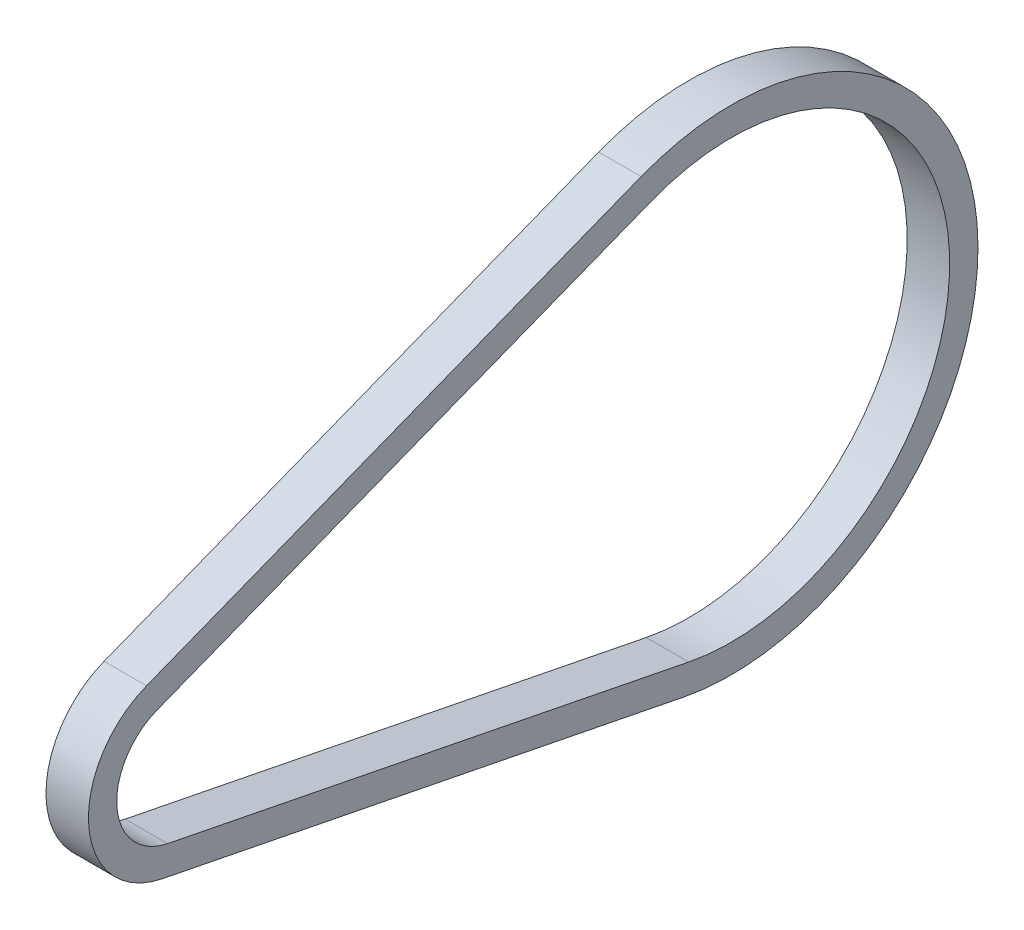
ISO-10303-21;
HEADER;
FILE_DESCRIPTION(('STEP AP214'),'2;1');
FILE_NAME('part.step','',(''),(''),'','','');
FILE_SCHEMA(('AUTOMOTIVE_DESIGN { 1 0 10303 214 1 1 1 1 }'));
ENDSEC;
DATA;
#1=APPLICATION_CONTEXT('core data for automotive mechanical design processes');
#2=APPLICATION_PROTOCOL_DEFINITION('international standard','automotive_design',2000,#1);
#3=PRODUCT_CONTEXT('',#1,'mechanical');
#4=PRODUCT('Part','Part','',(#3));
#5=PRODUCT_RELATED_PRODUCT_CATEGORY('part','',(#4));
#6=PRODUCT_DEFINITION_FORMATION('','',#4);
#7=PRODUCT_DEFINITION_CONTEXT('part definition',#1,'design');
#8=PRODUCT_DEFINITION('design','',#6,#7);
#9=PRODUCT_DEFINITION_SHAPE('','',#8);
#10=(LENGTH_UNIT() NAMED_UNIT(*) SI_UNIT(.MILLI.,.METRE.));
#11=(NAMED_UNIT(*) PLANE_ANGLE_UNIT() SI_UNIT($,.RADIAN.));
#12=(NAMED_UNIT(*) SI_UNIT($,.STERADIAN.) SOLID_ANGLE_UNIT());
#13=UNCERTAINTY_MEASURE_WITH_UNIT(LENGTH_MEASURE(1.E-05),#10,'distance_accuracy_value','');
#14=(GEOMETRIC_REPRESENTATION_CONTEXT(3) GLOBAL_UNCERTAINTY_ASSIGNED_CONTEXT((#13)) GLOBAL_UNIT_ASSIGNED_CONTEXT((#10,
#11,#12)) REPRESENTATION_CONTEXT('',''));
#15=CARTESIAN_POINT('',(0.,0.,0.));
#16=DIRECTION('',(0.,0.,1.));
#17=DIRECTION('',(1.,0.,0.));
#18=AXIS2_PLACEMENT_3D('',#15,#16,#17);
#19=CARTESIAN_POINT('',(102.63,220.816574262264,-819.81973874723));
#20=DIRECTION('',(-1.,0.,0.));
#21=DIRECTION('',(0.,0.,1.));
#22=AXIS2_PLACEMENT_3D('',#19,#20,#21);
#23=PLANE('',#22);
#24=CARTESIAN_POINT('',(102.63,220.816574262264,-819.81973874723));
#25=DIRECTION('',(-1.,0.,0.));
#26=DIRECTION('',(0.,0.,1.));
#27=AXIS2_PLACEMENT_3D('',#24,#25,#26);
#28=CIRCLE('',#27,88.5833704758753);
#29=CARTESIAN_POINT('',(102.63,303.298899780683,-787.513709868091));
#30=VERTEX_POINT('',#29);
#31=CARTESIAN_POINT('',(102.63,133.923548514245,-802.597206958313));
#32=VERTEX_POINT('',#31);
#33=EDGE_CURVE('E164',#30,#32,#28,.T.);
#34=ORIENTED_EDGE('',*,*,#33,.T.);
#35=DIRECTION('',(0.,0.19442172606886,0.980918035532228));
#36=VECTOR('',#35,1.);
#37=CARTESIAN_POINT('',(102.63,170.984199418033,-615.614704461583));
#38=LINE('',#37,#36);
#39=CARTESIAN_POINT('',(102.63,170.984199418033,-615.614704461583));
#40=VERTEX_POINT('',#39);
#41=EDGE_CURVE('E167',#32,#40,#38,.T.);
#42=ORIENTED_EDGE('',*,*,#41,.T.);
#43=CARTESIAN_POINT('',(102.63,203.2,-622.));
#44=DIRECTION('',(-1.,0.,0.));
#45=DIRECTION('',(0.,0.,1.));
#46=AXIS2_PLACEMENT_3D('',#43,#44,#45);
#47=CIRCLE('',#46,32.8425);
#48=CARTESIAN_POINT('',(102.63,233.780522746946,-610.022461238906));
#49=VERTEX_POINT('',#48);
#50=EDGE_CURVE('E170',#40,#49,#47,.T.);
#51=ORIENTED_EDGE('',*,*,#50,.T.);
#52=DIRECTION('',(0.,0.364696316087195,-0.931126520421596));
#53=VECTOR('',#52,1.);
#54=CARTESIAN_POINT('',(102.63,303.298899780683,-787.513709868091));
#55=LINE('',#54,#53);
#56=EDGE_CURVE('E172',#49,#30,#55,.T.);
#57=ORIENTED_EDGE('',*,*,#56,.T.);
#58=EDGE_LOOP('',(#34,#42,#51,#57));
#59=FACE_BOUND('',#58,.T.);
#60=DIRECTION('',(0.,0.19442172606886,0.980918035532228));
#61=VECTOR('',#60,1.);
#62=CARTESIAN_POINT('',(102.63,180.95032665904,-617.590029198443));
#63=LINE('',#62,#61);
#64=CARTESIAN_POINT('',(102.63,143.889675755253,-804.572531695173));
#65=VERTEX_POINT('',#64);
#66=CARTESIAN_POINT('',(102.63,180.95032665904,-617.590029198443));
#67=VERTEX_POINT('',#66);
#68=EDGE_CURVE('E136',#65,#67,#63,.T.);
#69=ORIENTED_EDGE('',*,*,#68,.F.);
#70=CARTESIAN_POINT('',(102.63,220.816574262264,-819.81973874723));
#71=DIRECTION('',(-1.,0.,0.));
#72=DIRECTION('',(0.,0.,1.));
#73=AXIS2_PLACEMENT_3D('',#70,#71,#72);
#74=CIRCLE('',#73,78.4233704758753);
#75=CARTESIAN_POINT('',(102.63,293.8386543332,-791.219024439537));
#76=VERTEX_POINT('',#75);
#77=EDGE_CURVE('E128',#76,#65,#74,.T.);
#78=ORIENTED_EDGE('',*,*,#77,.F.);
#79=DIRECTION('',(0.,0.364696316087195,-0.931126520421596));
#80=VECTOR('',#79,1.);
#81=CARTESIAN_POINT('',(102.63,293.8386543332,-791.219024439537));
#82=LINE('',#81,#80);
#83=CARTESIAN_POINT('',(102.63,224.320277299463,-613.727775810352));
#84=VERTEX_POINT('',#83);
#85=EDGE_CURVE('E150',#84,#76,#82,.T.);
#86=ORIENTED_EDGE('',*,*,#85,.F.);
#87=CARTESIAN_POINT('',(102.63,203.2,-622.));
#88=DIRECTION('',(-1.,0.,0.));
#89=DIRECTION('',(0.,0.,1.));
#90=AXIS2_PLACEMENT_3D('',#87,#88,#89);
#91=CIRCLE('',#90,22.6825);
#92=EDGE_CURVE('E148',#67,#84,#91,.T.);
#93=ORIENTED_EDGE('',*,*,#92,.F.);
#94=EDGE_LOOP('',(#69,#78,#86,#93));
#95=FACE_BOUND('',#94,.T.);
#96=ADVANCED_FACE('F63',(#59,#95),#23,.T.);
#97=CARTESIAN_POINT('',(117.87,220.816574262264,-819.81973874723));
#98=DIRECTION('',(-1.,0.,0.));
#99=DIRECTION('',(0.,0.,1.));
#100=AXIS2_PLACEMENT_3D('',#97,#98,#99);
#101=PLANE('',#100);
#102=CARTESIAN_POINT('',(117.87,220.816574262264,-819.81973874723));
#103=DIRECTION('',(-1.,0.,0.));
#104=DIRECTION('',(0.,0.,1.));
#105=AXIS2_PLACEMENT_3D('',#102,#103,#104);
#106=CIRCLE('',#105,88.5833704758753);
#107=CARTESIAN_POINT('',(117.87,303.298899780683,-787.513709868091));
#108=VERTEX_POINT('',#107);
#109=CARTESIAN_POINT('',(117.87,133.923548514245,-802.597206958313));
#110=VERTEX_POINT('',#109);
#111=EDGE_CURVE('E144',#108,#110,#106,.T.);
#112=ORIENTED_EDGE('',*,*,#111,.F.);
#113=DIRECTION('',(0.,0.364696316087195,-0.931126520421596));
#114=VECTOR('',#113,1.);
#115=CARTESIAN_POINT('',(117.87,303.298899780683,-787.513709868091));
#116=LINE('',#115,#114);
#117=CARTESIAN_POINT('',(117.87,233.780522746946,-610.022461238906));
#118=VERTEX_POINT('',#117);
#119=EDGE_CURVE('E168',#118,#108,#116,.T.);
#120=ORIENTED_EDGE('',*,*,#119,.F.);
#121=CARTESIAN_POINT('',(117.87,203.2,-622.));
#122=DIRECTION('',(-1.,0.,0.));
#123=DIRECTION('',(0.,0.,1.));
#124=AXIS2_PLACEMENT_3D('',#121,#122,#123);
#125=CIRCLE('',#124,32.8425);
#126=CARTESIAN_POINT('',(117.87,170.984199418033,-615.614704461583));
#127=VERTEX_POINT('',#126);
#128=EDGE_CURVE('E179',#127,#118,#125,.T.);
#129=ORIENTED_EDGE('',*,*,#128,.F.);
#130=DIRECTION('',(0.,0.19442172606886,0.980918035532228));
#131=VECTOR('',#130,1.);
#132=CARTESIAN_POINT('',(117.87,170.984199418033,-615.614704461583));
#133=LINE('',#132,#131);
#134=EDGE_CURVE('E177',#110,#127,#133,.T.);
#135=ORIENTED_EDGE('',*,*,#134,.F.);
#136=EDGE_LOOP('',(#112,#120,#129,#135));
#137=FACE_BOUND('',#136,.T.);
#138=CARTESIAN_POINT('',(117.87,220.816574262264,-819.81973874723));
#139=DIRECTION('',(-1.,0.,0.));
#140=DIRECTION('',(0.,0.,1.));
#141=AXIS2_PLACEMENT_3D('',#138,#139,#140);
#142=CIRCLE('',#141,78.4233704758753);
#143=CARTESIAN_POINT('',(117.87,293.8386543332,-791.219024439537));
#144=VERTEX_POINT('',#143);
#145=CARTESIAN_POINT('',(117.87,143.889675755253,-804.572531695173));
#146=VERTEX_POINT('',#145);
#147=EDGE_CURVE('E86',#144,#146,#142,.T.);
#148=ORIENTED_EDGE('',*,*,#147,.T.);
#149=DIRECTION('',(0.,0.19442172606886,0.980918035532228));
#150=VECTOR('',#149,1.);
#151=CARTESIAN_POINT('',(117.87,180.95032665904,-617.590029198443));
#152=LINE('',#151,#150);
#153=CARTESIAN_POINT('',(117.87,180.95032665904,-617.590029198443));
#154=VERTEX_POINT('',#153);
#155=EDGE_CURVE('E143',#146,#154,#152,.T.);
#156=ORIENTED_EDGE('',*,*,#155,.T.);
#157=CARTESIAN_POINT('',(117.87,203.2,-622.));
#158=DIRECTION('',(-1.,0.,0.));
#159=DIRECTION('',(0.,0.,1.));
#160=AXIS2_PLACEMENT_3D('',#157,#158,#159);
#161=CIRCLE('',#160,22.6825);
#162=CARTESIAN_POINT('',(117.87,224.320277299463,-613.727775810352));
#163=VERTEX_POINT('',#162);
#164=EDGE_CURVE('E156',#154,#163,#161,.T.);
#165=ORIENTED_EDGE('',*,*,#164,.T.);
#166=DIRECTION('',(0.,0.364696316087195,-0.931126520421596));
#167=VECTOR('',#166,1.);
#168=CARTESIAN_POINT('',(117.87,293.8386543332,-791.219024439537));
#169=LINE('',#168,#167);
#170=EDGE_CURVE('E137',#163,#144,#169,.T.);
#171=ORIENTED_EDGE('',*,*,#170,.T.);
#172=EDGE_LOOP('',(#148,#156,#165,#171));
#173=FACE_BOUND('',#172,.T.);
#174=ADVANCED_FACE('F197',(#137,#173),#101,.F.);
#175=CARTESIAN_POINT('',(102.63,220.816574262264,-819.81973874723));
#176=DIRECTION('',(1.,0.,0.));
#177=DIRECTION('',(0.,0.,-1.));
#178=AXIS2_PLACEMENT_3D('',#175,#176,#177);
#179=CYLINDRICAL_SURFACE('',#178,88.5833704758753);
#180=ORIENTED_EDGE('',*,*,#111,.T.);
#181=DIRECTION('',(1.,0.,0.));
#182=VECTOR('',#181,1.);
#183=CARTESIAN_POINT('',(102.63,133.923548514245,-802.597206958313));
#184=LINE('',#183,#182);
#185=EDGE_CURVE('E12',#32,#110,#184,.T.);
#186=ORIENTED_EDGE('',*,*,#185,.F.);
#187=ORIENTED_EDGE('',*,*,#33,.F.);
#188=DIRECTION('',(1.,0.,0.));
#189=VECTOR('',#188,1.);
#190=CARTESIAN_POINT('',(102.63,303.298899780683,-787.513709868091));
#191=LINE('',#190,#189);
#192=EDGE_CURVE('E174',#30,#108,#191,.T.);
#193=ORIENTED_EDGE('',*,*,#192,.T.);
#194=EDGE_LOOP('',(#180,#186,#187,#193));
#195=FACE_BOUND('',#194,.T.);
#196=ADVANCED_FACE('F65',(#195),#179,.T.);
#197=CARTESIAN_POINT('',(102.63,170.984199418033,-615.614704461583));
#198=DIRECTION('',(0.,0.980918035532228,-0.19442172606886));
#199=DIRECTION('',(0.,0.19442172606886,0.980918035532228));
#200=AXIS2_PLACEMENT_3D('',#197,#198,#199);
#201=PLANE('',#200);
#202=ORIENTED_EDGE('',*,*,#134,.T.);
#203=DIRECTION('',(1.,0.,0.));
#204=VECTOR('',#203,1.);
#205=CARTESIAN_POINT('',(102.63,170.984199418033,-615.614704461583));
#206=LINE('',#205,#204);
#207=EDGE_CURVE('E71',#40,#127,#206,.T.);
#208=ORIENTED_EDGE('',*,*,#207,.F.);
#209=ORIENTED_EDGE('',*,*,#41,.F.);
#210=ORIENTED_EDGE('',*,*,#185,.T.);
#211=EDGE_LOOP('',(#202,#208,#209,#210));
#212=FACE_BOUND('',#211,.T.);
#213=ADVANCED_FACE('F207',(#212),#201,.F.);
#214=CARTESIAN_POINT('',(102.63,203.2,-622.));
#215=DIRECTION('',(1.,0.,0.));
#216=DIRECTION('',(0.,0.,-1.));
#217=AXIS2_PLACEMENT_3D('',#214,#215,#216);
#218=CYLINDRICAL_SURFACE('',#217,32.8425);
#219=ORIENTED_EDGE('',*,*,#128,.T.);
#220=DIRECTION('',(1.,0.,0.));
#221=VECTOR('',#220,1.);
#222=CARTESIAN_POINT('',(102.63,233.780522746946,-610.022461238906));
#223=LINE('',#222,#221);
#224=EDGE_CURVE('E184',#49,#118,#223,.T.);
#225=ORIENTED_EDGE('',*,*,#224,.F.);
#226=ORIENTED_EDGE('',*,*,#50,.F.);
#227=ORIENTED_EDGE('',*,*,#207,.T.);
#228=EDGE_LOOP('',(#219,#225,#226,#227));
#229=FACE_BOUND('',#228,.T.);
#230=ADVANCED_FACE('F191',(#229),#218,.T.);
#231=CARTESIAN_POINT('',(102.63,303.298899780683,-787.513709868091));
#232=DIRECTION('',(0.,-0.931126520421596,-0.364696316087195));
#233=DIRECTION('',(0.,0.364696316087195,-0.931126520421596));
#234=AXIS2_PLACEMENT_3D('',#231,#232,#233);
#235=PLANE('',#234);
#236=ORIENTED_EDGE('',*,*,#119,.T.);
#237=ORIENTED_EDGE('',*,*,#192,.F.);
#238=ORIENTED_EDGE('',*,*,#56,.F.);
#239=ORIENTED_EDGE('',*,*,#224,.T.);
#240=EDGE_LOOP('',(#236,#237,#238,#239));
#241=FACE_BOUND('',#240,.T.);
#242=ADVANCED_FACE('F201',(#241),#235,.F.);
#243=CARTESIAN_POINT('',(102.63,220.816574262264,-819.81973874723));
#244=DIRECTION('',(1.,0.,0.));
#245=DIRECTION('',(0.,0.,-1.));
#246=AXIS2_PLACEMENT_3D('',#243,#244,#245);
#247=CYLINDRICAL_SURFACE('',#246,78.4233704758753);
#248=ORIENTED_EDGE('',*,*,#147,.F.);
#249=DIRECTION('',(1.,0.,0.));
#250=VECTOR('',#249,1.);
#251=CARTESIAN_POINT('',(102.63,293.8386543332,-791.219024439537));
#252=LINE('',#251,#250);
#253=EDGE_CURVE('E132',#76,#144,#252,.T.);
#254=ORIENTED_EDGE('',*,*,#253,.F.);
#255=ORIENTED_EDGE('',*,*,#77,.T.);
#256=DIRECTION('',(1.,0.,0.));
#257=VECTOR('',#256,1.);
#258=CARTESIAN_POINT('',(102.63,143.889675755253,-804.572531695173));
#259=LINE('',#258,#257);
#260=EDGE_CURVE('E131',#65,#146,#259,.T.);
#261=ORIENTED_EDGE('',*,*,#260,.T.);
#262=EDGE_LOOP('',(#248,#254,#255,#261));
#263=FACE_BOUND('',#262,.T.);
#264=ADVANCED_FACE('F130',(#263),#247,.F.);
#265=CARTESIAN_POINT('',(102.63,180.95032665904,-617.590029198443));
#266=DIRECTION('',(0.,0.980918035532228,-0.19442172606886));
#267=DIRECTION('',(0.,0.19442172606886,0.980918035532228));
#268=AXIS2_PLACEMENT_3D('',#265,#266,#267);
#269=PLANE('',#268);
#270=ORIENTED_EDGE('',*,*,#155,.F.);
#271=ORIENTED_EDGE('',*,*,#260,.F.);
#272=ORIENTED_EDGE('',*,*,#68,.T.);
#273=DIRECTION('',(1.,0.,0.));
#274=VECTOR('',#273,1.);
#275=CARTESIAN_POINT('',(102.63,180.95032665904,-617.590029198443));
#276=LINE('',#275,#274);
#277=EDGE_CURVE('E145',#67,#154,#276,.T.);
#278=ORIENTED_EDGE('',*,*,#277,.T.);
#279=EDGE_LOOP('',(#270,#271,#272,#278));
#280=FACE_BOUND('',#279,.T.);
#281=ADVANCED_FACE('F140',(#280),#269,.T.);
#282=CARTESIAN_POINT('',(102.63,203.2,-622.));
#283=DIRECTION('',(1.,0.,0.));
#284=DIRECTION('',(0.,0.,-1.));
#285=AXIS2_PLACEMENT_3D('',#282,#283,#284);
#286=CYLINDRICAL_SURFACE('',#285,22.6825);
#287=ORIENTED_EDGE('',*,*,#164,.F.);
#288=ORIENTED_EDGE('',*,*,#277,.F.);
#289=ORIENTED_EDGE('',*,*,#92,.T.);
#290=DIRECTION('',(1.,0.,0.));
#291=VECTOR('',#290,1.);
#292=CARTESIAN_POINT('',(102.63,224.320277299463,-613.727775810352));
#293=LINE('',#292,#291);
#294=EDGE_CURVE('E78',#84,#163,#293,.T.);
#295=ORIENTED_EDGE('',*,*,#294,.T.);
#296=EDGE_LOOP('',(#287,#288,#289,#295));
#297=FACE_BOUND('',#296,.T.);
#298=ADVANCED_FACE('F230',(#297),#286,.F.);
#299=CARTESIAN_POINT('',(102.63,293.8386543332,-791.219024439537));
#300=DIRECTION('',(0.,-0.931126520421596,-0.364696316087195));
#301=DIRECTION('',(0.,0.364696316087195,-0.931126520421596));
#302=AXIS2_PLACEMENT_3D('',#299,#300,#301);
#303=PLANE('',#302);
#304=ORIENTED_EDGE('',*,*,#170,.F.);
#305=ORIENTED_EDGE('',*,*,#294,.F.);
#306=ORIENTED_EDGE('',*,*,#85,.T.);
#307=ORIENTED_EDGE('',*,*,#253,.T.);
#308=EDGE_LOOP('',(#304,#305,#306,#307));
#309=FACE_BOUND('',#308,.T.);
#310=ADVANCED_FACE('F234',(#309),#303,.T.);
#311=CLOSED_SHELL('',(#96,#174,#196,#213,#230,#242,#264,#281,#298,#310));
#312=MANIFOLD_SOLID_BREP('B2',#311);
#313=ADVANCED_BREP_SHAPE_REPRESENTATION('',(#18,#312),#14);
#314=SHAPE_DEFINITION_REPRESENTATION(#9,#313);
ENDSEC;
END-ISO-10303-21;
